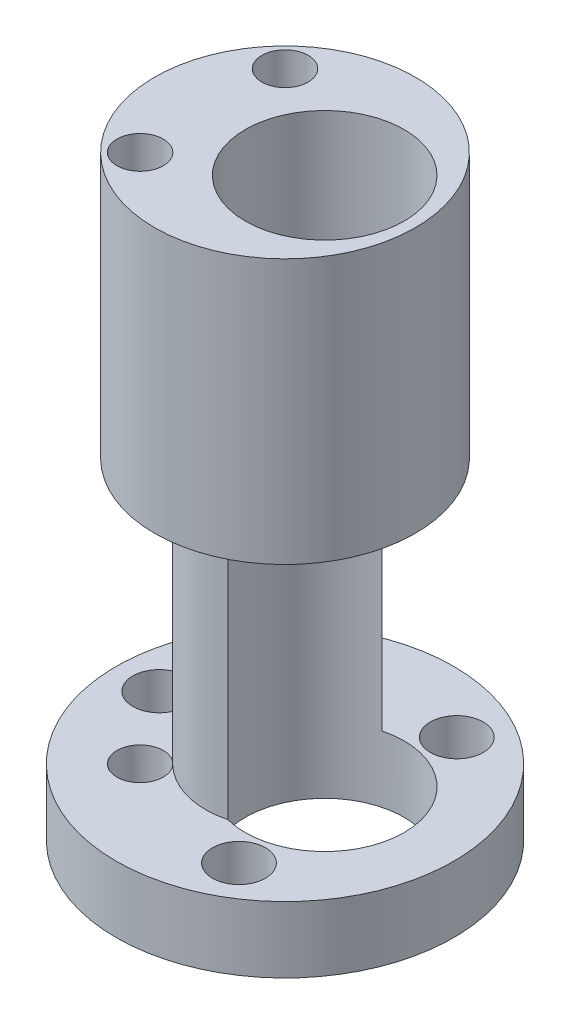
ISO-10303-21;
HEADER;
FILE_DESCRIPTION(('STEP AP214'),'2;1');
FILE_NAME('part.step','',(''),(''),'','','');
FILE_SCHEMA(('AUTOMOTIVE_DESIGN { 1 0 10303 214 1 1 1 1 }'));
ENDSEC;
DATA;
#1=APPLICATION_CONTEXT('core data for automotive mechanical design processes');
#2=APPLICATION_PROTOCOL_DEFINITION('international standard','automotive_design',2000,#1);
#3=PRODUCT_CONTEXT('',#1,'mechanical');
#4=PRODUCT('Part','Part','',(#3));
#5=PRODUCT_RELATED_PRODUCT_CATEGORY('part','',(#4));
#6=PRODUCT_DEFINITION_FORMATION('','',#4);
#7=PRODUCT_DEFINITION_CONTEXT('part definition',#1,'design');
#8=PRODUCT_DEFINITION('design','',#6,#7);
#9=PRODUCT_DEFINITION_SHAPE('','',#8);
#10=(LENGTH_UNIT() NAMED_UNIT(*) SI_UNIT(.MILLI.,.METRE.));
#11=(NAMED_UNIT(*) PLANE_ANGLE_UNIT() SI_UNIT($,.RADIAN.));
#12=(NAMED_UNIT(*) SI_UNIT($,.STERADIAN.) SOLID_ANGLE_UNIT());
#13=UNCERTAINTY_MEASURE_WITH_UNIT(LENGTH_MEASURE(1.E-05),#10,'distance_accuracy_value','');
#14=(GEOMETRIC_REPRESENTATION_CONTEXT(3) GLOBAL_UNCERTAINTY_ASSIGNED_CONTEXT((#13)) GLOBAL_UNIT_ASSIGNED_CONTEXT((#10,
#11,#12)) REPRESENTATION_CONTEXT('',''));
#15=CARTESIAN_POINT('',(0.,0.,0.));
#16=DIRECTION('',(0.,0.,1.));
#17=DIRECTION('',(1.,0.,0.));
#18=AXIS2_PLACEMENT_3D('',#15,#16,#17);
#19=CARTESIAN_POINT('',(0.,5.,0.));
#20=DIRECTION('',(0.,1.,0.));
#21=DIRECTION('',(0.,0.,1.));
#22=AXIS2_PLACEMENT_3D('',#19,#20,#21);
#23=PLANE('',#22);
#24=CARTESIAN_POINT('',(-5.47300648638387,5.,5.47300648638389));
#25=DIRECTION('',(0.,1.,0.));
#26=DIRECTION('',(0.,0.,1.));
#27=AXIS2_PLACEMENT_3D('',#24,#25,#26);
#28=CIRCLE('',#27,1.74999999999999);
#29=CARTESIAN_POINT('',(-4.35734177160285,5.,4.12475122709782));
#30=VERTEX_POINT('',#29);
#31=CARTESIAN_POINT('',(-4.1247512270978,5.,4.35734177160287));
#32=VERTEX_POINT('',#31);
#33=EDGE_CURVE('E93',#30,#32,#28,.T.);
#34=ORIENTED_EDGE('',*,*,#33,.F.);
#35=CARTESIAN_POINT('',(0.,5.,0.));
#36=DIRECTION('',(0.,1.,0.));
#37=DIRECTION('',(0.,0.,1.));
#38=AXIS2_PLACEMENT_3D('',#35,#36,#37);
#39=CIRCLE('',#38,6.);
#40=CARTESIAN_POINT('',(-4.35734177160288,5.,-4.12475122709779));
#41=VERTEX_POINT('',#40);
#42=EDGE_CURVE('E87',#41,#30,#39,.T.);
#43=ORIENTED_EDGE('',*,*,#42,.F.);
#44=CARTESIAN_POINT('',(-5.47300648638391,5.,-5.47300648638385));
#45=DIRECTION('',(0.,1.,0.));
#46=DIRECTION('',(0.,0.,1.));
#47=AXIS2_PLACEMENT_3D('',#44,#45,#46);
#48=CIRCLE('',#47,1.74999999999999);
#49=CARTESIAN_POINT('',(-4.12475122709783,5.,-4.35734177160283));
#50=VERTEX_POINT('',#49);
#51=EDGE_CURVE('E167',#50,#41,#48,.T.);
#52=ORIENTED_EDGE('',*,*,#51,.F.);
#53=CARTESIAN_POINT('',(1.50000000000002,5.,-5.80947501931112));
#54=VERTEX_POINT('',#53);
#55=EDGE_CURVE('E106',#54,#50,#39,.T.);
#56=ORIENTED_EDGE('',*,*,#55,.F.);
#57=CARTESIAN_POINT('',(3.,5.,0.));
#58=DIRECTION('',(0.,1.,0.));
#59=DIRECTION('',(0.,0.,1.));
#60=AXIS2_PLACEMENT_3D('',#57,#58,#59);
#61=CIRCLE('',#60,5.99999999999999);
#62=CARTESIAN_POINT('',(1.50000000000002,5.,5.80947501931112));
#63=VERTEX_POINT('',#62);
#64=EDGE_CURVE('E166',#63,#54,#61,.T.);
#65=ORIENTED_EDGE('',*,*,#64,.F.);
#66=EDGE_CURVE('E88',#32,#63,#39,.T.);
#67=ORIENTED_EDGE('',*,*,#66,.F.);
#68=EDGE_LOOP('',(#34,#43,#52,#56,#65,#67));
#69=FACE_BOUND('',#68,.T.);
#70=CARTESIAN_POINT('',(0.,5.,0.));
#71=DIRECTION('',(0.,1.,0.));
#72=DIRECTION('',(0.,0.,1.));
#73=AXIS2_PLACEMENT_3D('',#70,#71,#72);
#74=CIRCLE('',#73,12.75);
#75=CARTESIAN_POINT('',(0.,5.,12.75));
#76=VERTEX_POINT('',#75);
#77=EDGE_CURVE('E131',#76,#76,#74,.T.);
#78=ORIENTED_EDGE('',*,*,#77,.T.);
#79=EDGE_LOOP('',(#78));
#80=FACE_BOUND('',#79,.T.);
#81=CARTESIAN_POINT('',(4.75000000000004,5.,-8.22724133595215));
#82=DIRECTION('',(0.,1.,0.));
#83=DIRECTION('',(0.,0.,1.));
#84=AXIS2_PLACEMENT_3D('',#81,#82,#83);
#85=CIRCLE('',#84,1.99999999999999);
#86=CARTESIAN_POINT('',(4.75000000000004,5.,-6.22724133595215));
#87=VERTEX_POINT('',#86);
#88=EDGE_CURVE('E124',#87,#87,#85,.T.);
#89=ORIENTED_EDGE('',*,*,#88,.F.);
#90=EDGE_LOOP('',(#89));
#91=FACE_BOUND('',#90,.T.);
#92=CARTESIAN_POINT('',(4.75000000000004,5.,8.22724133595214));
#93=DIRECTION('',(0.,1.,0.));
#94=DIRECTION('',(0.,0.,1.));
#95=AXIS2_PLACEMENT_3D('',#92,#93,#94);
#96=CIRCLE('',#95,1.99999999999999);
#97=CARTESIAN_POINT('',(4.75000000000004,5.,10.2272413359521));
#98=VERTEX_POINT('',#97);
#99=EDGE_CURVE('E118',#98,#98,#96,.T.);
#100=ORIENTED_EDGE('',*,*,#99,.F.);
#101=EDGE_LOOP('',(#100));
#102=FACE_BOUND('',#101,.T.);
#103=CARTESIAN_POINT('',(-9.5,5.,0.));
#104=DIRECTION('',(0.,1.,0.));
#105=DIRECTION('',(0.,0.,1.));
#106=AXIS2_PLACEMENT_3D('',#103,#104,#105);
#107=CIRCLE('',#106,1.99999999999999);
#108=CARTESIAN_POINT('',(-9.5,5.,1.99999999999999));
#109=VERTEX_POINT('',#108);
#110=EDGE_CURVE('E112',#109,#109,#107,.T.);
#111=ORIENTED_EDGE('',*,*,#110,.F.);
#112=EDGE_LOOP('',(#111));
#113=FACE_BOUND('',#112,.T.);
#114=ADVANCED_FACE('F32',(#69,#80,#91,#102,#113),#23,.T.);
#115=CARTESIAN_POINT('',(0.,5.,0.));
#116=DIRECTION('',(0.,-1.,0.));
#117=DIRECTION('',(0.,0.,-1.));
#118=AXIS2_PLACEMENT_3D('',#115,#116,#117);
#119=CYLINDRICAL_SURFACE('',#118,12.75);
#120=ORIENTED_EDGE('',*,*,#77,.F.);
#121=EDGE_LOOP('',(#120));
#122=FACE_BOUND('',#121,.T.);
#123=CARTESIAN_POINT('',(0.,0.,0.));
#124=DIRECTION('',(0.,1.,0.));
#125=DIRECTION('',(0.,0.,1.));
#126=AXIS2_PLACEMENT_3D('',#123,#124,#125);
#127=CIRCLE('',#126,12.75);
#128=CARTESIAN_POINT('',(0.,0.,12.75));
#129=VERTEX_POINT('',#128);
#130=EDGE_CURVE('E130',#129,#129,#127,.T.);
#131=ORIENTED_EDGE('',*,*,#130,.T.);
#132=EDGE_LOOP('',(#131));
#133=FACE_BOUND('',#132,.T.);
#134=ADVANCED_FACE('F34',(#122,#133),#119,.T.);
#135=CARTESIAN_POINT('',(0.,0.,0.));
#136=DIRECTION('',(0.,1.,0.));
#137=DIRECTION('',(0.,0.,1.));
#138=AXIS2_PLACEMENT_3D('',#135,#136,#137);
#139=PLANE('',#138);
#140=CARTESIAN_POINT('',(-5.47300648638387,0.,5.47300648638389));
#141=DIRECTION('',(0.,1.,0.));
#142=DIRECTION('',(0.,0.,1.));
#143=AXIS2_PLACEMENT_3D('',#140,#141,#142);
#144=CIRCLE('',#143,1.74999999999999);
#145=CARTESIAN_POINT('',(-5.47300648638387,0.,7.22300648638388));
#146=VERTEX_POINT('',#145);
#147=EDGE_CURVE('E95',#146,#146,#144,.T.);
#148=ORIENTED_EDGE('',*,*,#147,.T.);
#149=EDGE_LOOP('',(#148));
#150=FACE_BOUND('',#149,.T.);
#151=CARTESIAN_POINT('',(-5.47300648638391,0.,-5.47300648638385));
#152=DIRECTION('',(0.,1.,0.));
#153=DIRECTION('',(0.,0.,1.));
#154=AXIS2_PLACEMENT_3D('',#151,#152,#153);
#155=CIRCLE('',#154,1.74999999999999);
#156=CARTESIAN_POINT('',(-5.47300648638391,0.,-3.72300648638385));
#157=VERTEX_POINT('',#156);
#158=EDGE_CURVE('E170',#157,#157,#155,.T.);
#159=ORIENTED_EDGE('',*,*,#158,.T.);
#160=EDGE_LOOP('',(#159));
#161=FACE_BOUND('',#160,.T.);
#162=CARTESIAN_POINT('',(3.,0.,0.));
#163=DIRECTION('',(0.,1.,0.));
#164=DIRECTION('',(0.,0.,1.));
#165=AXIS2_PLACEMENT_3D('',#162,#163,#164);
#166=CIRCLE('',#165,5.99999999999999);
#167=CARTESIAN_POINT('',(3.,0.,5.99999999999999));
#168=VERTEX_POINT('',#167);
#169=EDGE_CURVE('E164',#168,#168,#166,.T.);
#170=ORIENTED_EDGE('',*,*,#169,.T.);
#171=EDGE_LOOP('',(#170));
#172=FACE_BOUND('',#171,.T.);
#173=CARTESIAN_POINT('',(-9.5,0.,0.));
#174=DIRECTION('',(0.,1.,0.));
#175=DIRECTION('',(0.,0.,1.));
#176=AXIS2_PLACEMENT_3D('',#173,#174,#175);
#177=CIRCLE('',#176,2.);
#178=CARTESIAN_POINT('',(-9.5,0.,2.));
#179=VERTEX_POINT('',#178);
#180=EDGE_CURVE('E115',#179,#179,#177,.T.);
#181=ORIENTED_EDGE('',*,*,#180,.T.);
#182=EDGE_LOOP('',(#181));
#183=FACE_BOUND('',#182,.T.);
#184=CARTESIAN_POINT('',(4.75000000000004,0.,8.22724133595214));
#185=DIRECTION('',(0.,1.,0.));
#186=DIRECTION('',(0.,0.,1.));
#187=AXIS2_PLACEMENT_3D('',#184,#185,#186);
#188=CIRCLE('',#187,2.);
#189=CARTESIAN_POINT('',(4.75000000000004,0.,10.2272413359521));
#190=VERTEX_POINT('',#189);
#191=EDGE_CURVE('E121',#190,#190,#188,.T.);
#192=ORIENTED_EDGE('',*,*,#191,.T.);
#193=EDGE_LOOP('',(#192));
#194=FACE_BOUND('',#193,.T.);
#195=CARTESIAN_POINT('',(4.75000000000004,0.,-8.22724133595215));
#196=DIRECTION('',(0.,1.,0.));
#197=DIRECTION('',(0.,0.,1.));
#198=AXIS2_PLACEMENT_3D('',#195,#196,#197);
#199=CIRCLE('',#198,2.);
#200=CARTESIAN_POINT('',(4.75000000000004,0.,-6.22724133595215));
#201=VERTEX_POINT('',#200);
#202=EDGE_CURVE('E127',#201,#201,#199,.T.);
#203=ORIENTED_EDGE('',*,*,#202,.T.);
#204=EDGE_LOOP('',(#203));
#205=FACE_BOUND('',#204,.T.);
#206=ORIENTED_EDGE('',*,*,#130,.F.);
#207=EDGE_LOOP('',(#206));
#208=FACE_BOUND('',#207,.T.);
#209=ADVANCED_FACE('F219',(#150,#161,#172,#183,#194,#205,#208),#139,.F.);
#210=CARTESIAN_POINT('',(4.75000000000004,5.,-8.22724133595215));
#211=DIRECTION('',(0.,1.,0.));
#212=DIRECTION('',(0.,0.,1.));
#213=AXIS2_PLACEMENT_3D('',#210,#211,#212);
#214=CYLINDRICAL_SURFACE('',#213,2.);
#215=ORIENTED_EDGE('',*,*,#202,.F.);
#216=EDGE_LOOP('',(#215));
#217=FACE_BOUND('',#216,.T.);
#218=ORIENTED_EDGE('',*,*,#88,.T.);
#219=EDGE_LOOP('',(#218));
#220=FACE_BOUND('',#219,.T.);
#221=ADVANCED_FACE('F222',(#217,#220),#214,.F.);
#222=CARTESIAN_POINT('',(4.75000000000004,5.,8.22724133595214));
#223=DIRECTION('',(0.,1.,0.));
#224=DIRECTION('',(0.,0.,1.));
#225=AXIS2_PLACEMENT_3D('',#222,#223,#224);
#226=CYLINDRICAL_SURFACE('',#225,2.);
#227=ORIENTED_EDGE('',*,*,#191,.F.);
#228=EDGE_LOOP('',(#227));
#229=FACE_BOUND('',#228,.T.);
#230=ORIENTED_EDGE('',*,*,#99,.T.);
#231=EDGE_LOOP('',(#230));
#232=FACE_BOUND('',#231,.T.);
#233=ADVANCED_FACE('F229',(#229,#232),#226,.F.);
#234=CARTESIAN_POINT('',(-9.5,5.,0.));
#235=DIRECTION('',(0.,1.,0.));
#236=DIRECTION('',(0.,0.,1.));
#237=AXIS2_PLACEMENT_3D('',#234,#235,#236);
#238=CYLINDRICAL_SURFACE('',#237,2.);
#239=ORIENTED_EDGE('',*,*,#180,.F.);
#240=EDGE_LOOP('',(#239));
#241=FACE_BOUND('',#240,.T.);
#242=ORIENTED_EDGE('',*,*,#110,.T.);
#243=EDGE_LOOP('',(#242));
#244=FACE_BOUND('',#243,.T.);
#245=ADVANCED_FACE('F211',(#241,#244),#238,.F.);
#246=CARTESIAN_POINT('',(0.,25.,0.));
#247=DIRECTION('',(0.,-1.,0.));
#248=DIRECTION('',(0.,0.,-1.));
#249=AXIS2_PLACEMENT_3D('',#246,#247,#248);
#250=CYLINDRICAL_SURFACE('',#249,6.);
#251=ORIENTED_EDGE('',*,*,#55,.T.);
#252=EDGE_CURVE('E105',#50,#41,#39,.T.);
#253=ORIENTED_EDGE('',*,*,#252,.T.);
#254=ORIENTED_EDGE('',*,*,#42,.T.);
#255=EDGE_CURVE('E83',#30,#32,#39,.T.);
#256=ORIENTED_EDGE('',*,*,#255,.T.);
#257=ORIENTED_EDGE('',*,*,#66,.T.);
#258=DIRECTION('',(0.,1.,0.));
#259=VECTOR('',#258,1.);
#260=CARTESIAN_POINT('',(1.50000000000002,22.5,5.80947501931112));
#261=LINE('',#260,#259);
#262=CARTESIAN_POINT('',(1.50000000000002,25.,5.80947501931112));
#263=VERTEX_POINT('',#262);
#264=EDGE_CURVE('E152',#63,#263,#261,.T.);
#265=ORIENTED_EDGE('',*,*,#264,.T.);
#266=CARTESIAN_POINT('',(0.,25.,0.));
#267=DIRECTION('',(0.,1.,0.));
#268=DIRECTION('',(0.,0.,1.));
#269=AXIS2_PLACEMENT_3D('',#266,#267,#268);
#270=CIRCLE('',#269,6.);
#271=CARTESIAN_POINT('',(-4.12475122709779,25.,4.35734177160287));
#272=VERTEX_POINT('',#271);
#273=EDGE_CURVE('E109',#272,#263,#270,.T.);
#274=ORIENTED_EDGE('',*,*,#273,.F.);
#275=CARTESIAN_POINT('',(-4.35734177160286,25.,4.12475122709781));
#276=VERTEX_POINT('',#275);
#277=EDGE_CURVE('E150',#276,#272,#270,.T.);
#278=ORIENTED_EDGE('',*,*,#277,.F.);
#279=CARTESIAN_POINT('',(-4.35734177160289,25.,-4.12475122709778));
#280=VERTEX_POINT('',#279);
#281=EDGE_CURVE('E144',#280,#276,#270,.T.);
#282=ORIENTED_EDGE('',*,*,#281,.F.);
#283=CARTESIAN_POINT('',(-4.12475122709782,25.,-4.35734177160284));
#284=VERTEX_POINT('',#283);
#285=EDGE_CURVE('E153',#284,#280,#270,.T.);
#286=ORIENTED_EDGE('',*,*,#285,.F.);
#287=CARTESIAN_POINT('',(1.50000000000002,25.,-5.80947501931112));
#288=VERTEX_POINT('',#287);
#289=EDGE_CURVE('E110',#288,#284,#270,.T.);
#290=ORIENTED_EDGE('',*,*,#289,.F.);
#291=DIRECTION('',(0.,1.,0.));
#292=VECTOR('',#291,1.);
#293=CARTESIAN_POINT('',(1.50000000000002,22.5,-5.80947501931112));
#294=LINE('',#293,#292);
#295=EDGE_CURVE('E161',#288,#54,#294,.F.);
#296=ORIENTED_EDGE('',*,*,#295,.T.);
#297=EDGE_LOOP('',(#251,#253,#254,#256,#257,#265,#274,#278,#282,#286,#290,#296));
#298=FACE_BOUND('',#297,.T.);
#299=ADVANCED_FACE('F104',(#298),#250,.T.);
#300=CARTESIAN_POINT('',(0.,25.,0.));
#301=DIRECTION('',(0.,1.,0.));
#302=DIRECTION('',(0.,0.,1.));
#303=AXIS2_PLACEMENT_3D('',#300,#301,#302);
#304=PLANE('',#303);
#305=CARTESIAN_POINT('',(0.,25.,0.));
#306=DIRECTION('',(0.,1.,0.));
#307=DIRECTION('',(0.,0.,1.));
#308=AXIS2_PLACEMENT_3D('',#305,#306,#307);
#309=CIRCLE('',#308,9.85);
#310=CARTESIAN_POINT('',(0.,25.,9.85));
#311=VERTEX_POINT('',#310);
#312=EDGE_CURVE('E194',#311,#311,#309,.T.);
#313=ORIENTED_EDGE('',*,*,#312,.F.);
#314=EDGE_LOOP('',(#313));
#315=FACE_BOUND('',#314,.T.);
#316=ORIENTED_EDGE('',*,*,#289,.T.);
#317=CARTESIAN_POINT('',(-5.47300648638391,25.,-5.47300648638385));
#318=DIRECTION('',(0.,1.,0.));
#319=DIRECTION('',(0.,0.,1.));
#320=AXIS2_PLACEMENT_3D('',#317,#318,#319);
#321=CIRCLE('',#320,1.74999999999999);
#322=EDGE_CURVE('E11',#284,#280,#321,.T.);
#323=ORIENTED_EDGE('',*,*,#322,.T.);
#324=ORIENTED_EDGE('',*,*,#281,.T.);
#325=CARTESIAN_POINT('',(-5.47300648638387,25.,5.47300648638389));
#326=DIRECTION('',(0.,1.,0.));
#327=DIRECTION('',(0.,0.,1.));
#328=AXIS2_PLACEMENT_3D('',#325,#326,#327);
#329=CIRCLE('',#328,1.74999999999999);
#330=EDGE_CURVE('E40',#276,#272,#329,.T.);
#331=ORIENTED_EDGE('',*,*,#330,.T.);
#332=ORIENTED_EDGE('',*,*,#273,.T.);
#333=CARTESIAN_POINT('',(3.,25.,0.));
#334=DIRECTION('',(0.,1.,0.));
#335=DIRECTION('',(0.,0.,1.));
#336=AXIS2_PLACEMENT_3D('',#333,#334,#335);
#337=CIRCLE('',#336,5.99999999999999);
#338=EDGE_CURVE('E159',#263,#288,#337,.T.);
#339=ORIENTED_EDGE('',*,*,#338,.T.);
#340=EDGE_LOOP('',(#316,#323,#324,#331,#332,#339));
#341=FACE_BOUND('',#340,.T.);
#342=ADVANCED_FACE('F140',(#315,#341),#304,.F.);
#343=CARTESIAN_POINT('',(0.,45.,0.));
#344=DIRECTION('',(0.,-1.,0.));
#345=DIRECTION('',(0.,0.,-1.));
#346=AXIS2_PLACEMENT_3D('',#343,#344,#345);
#347=CYLINDRICAL_SURFACE('',#346,9.85);
#348=CARTESIAN_POINT('',(0.,45.,0.));
#349=DIRECTION('',(0.,1.,0.));
#350=DIRECTION('',(0.,0.,1.));
#351=AXIS2_PLACEMENT_3D('',#348,#349,#350);
#352=CIRCLE('',#351,9.85);
#353=CARTESIAN_POINT('',(0.,45.,9.85));
#354=VERTEX_POINT('',#353);
#355=EDGE_CURVE('E195',#354,#354,#352,.T.);
#356=ORIENTED_EDGE('',*,*,#355,.F.);
#357=EDGE_LOOP('',(#356));
#358=FACE_BOUND('',#357,.T.);
#359=ORIENTED_EDGE('',*,*,#312,.T.);
#360=EDGE_LOOP('',(#359));
#361=FACE_BOUND('',#360,.T.);
#362=ADVANCED_FACE('F200',(#358,#361),#347,.T.);
#363=CARTESIAN_POINT('',(0.,45.,0.));
#364=DIRECTION('',(0.,1.,0.));
#365=DIRECTION('',(0.,0.,1.));
#366=AXIS2_PLACEMENT_3D('',#363,#364,#365);
#367=PLANE('',#366);
#368=CARTESIAN_POINT('',(-5.47300648638391,45.,-5.47300648638385));
#369=DIRECTION('',(0.,1.,0.));
#370=DIRECTION('',(0.,0.,1.));
#371=AXIS2_PLACEMENT_3D('',#368,#369,#370);
#372=CIRCLE('',#371,1.74999999999999);
#373=CARTESIAN_POINT('',(-5.47300648638391,45.,-3.72300648638386));
#374=VERTEX_POINT('',#373);
#375=EDGE_CURVE('E176',#374,#374,#372,.T.);
#376=ORIENTED_EDGE('',*,*,#375,.F.);
#377=EDGE_LOOP('',(#376));
#378=FACE_BOUND('',#377,.T.);
#379=CARTESIAN_POINT('',(-5.47300648638387,45.,5.47300648638389));
#380=DIRECTION('',(0.,1.,0.));
#381=DIRECTION('',(0.,0.,1.));
#382=AXIS2_PLACEMENT_3D('',#379,#380,#381);
#383=CIRCLE('',#382,1.74999999999999);
#384=CARTESIAN_POINT('',(-5.47300648638387,45.,7.22300648638388));
#385=VERTEX_POINT('',#384);
#386=EDGE_CURVE('E181',#385,#385,#383,.T.);
#387=ORIENTED_EDGE('',*,*,#386,.F.);
#388=EDGE_LOOP('',(#387));
#389=FACE_BOUND('',#388,.T.);
#390=CARTESIAN_POINT('',(3.,45.,0.));
#391=DIRECTION('',(0.,1.,0.));
#392=DIRECTION('',(0.,0.,1.));
#393=AXIS2_PLACEMENT_3D('',#390,#391,#392);
#394=CIRCLE('',#393,5.99999999999999);
#395=CARTESIAN_POINT('',(3.,45.,5.99999999999999));
#396=VERTEX_POINT('',#395);
#397=EDGE_CURVE('E186',#396,#396,#394,.T.);
#398=ORIENTED_EDGE('',*,*,#397,.F.);
#399=EDGE_LOOP('',(#398));
#400=FACE_BOUND('',#399,.T.);
#401=ORIENTED_EDGE('',*,*,#355,.T.);
#402=EDGE_LOOP('',(#401));
#403=FACE_BOUND('',#402,.T.);
#404=ADVANCED_FACE('F208',(#378,#389,#400,#403),#367,.T.);
#405=CARTESIAN_POINT('',(3.,45.,0.));
#406=DIRECTION('',(0.,1.,0.));
#407=DIRECTION('',(0.,0.,1.));
#408=AXIS2_PLACEMENT_3D('',#405,#406,#407);
#409=CYLINDRICAL_SURFACE('',#408,5.99999999999999);
#410=ORIENTED_EDGE('',*,*,#397,.T.);
#411=EDGE_LOOP('',(#410));
#412=FACE_BOUND('',#411,.T.);
#413=ORIENTED_EDGE('',*,*,#169,.F.);
#414=EDGE_LOOP('',(#413));
#415=FACE_BOUND('',#414,.T.);
#416=ORIENTED_EDGE('',*,*,#64,.T.);
#417=ORIENTED_EDGE('',*,*,#295,.F.);
#418=ORIENTED_EDGE('',*,*,#338,.F.);
#419=ORIENTED_EDGE('',*,*,#264,.F.);
#420=EDGE_LOOP('',(#416,#417,#418,#419));
#421=FACE_BOUND('',#420,.T.);
#422=ADVANCED_FACE('F340',(#412,#415,#421),#409,.F.);
#423=CARTESIAN_POINT('',(0.,25.,0.));
#424=DIRECTION('',(0.,1.,0.));
#425=DIRECTION('',(0.,0.,1.));
#426=AXIS2_PLACEMENT_3D('',#423,#424,#425);
#427=PLANE('',#426);
#428=ORIENTED_EDGE('',*,*,#277,.T.);
#429=CARTESIAN_POINT('',(-5.47300648638387,25.,5.47300648638389));
#430=DIRECTION('',(0.,1.,0.));
#431=DIRECTION('',(0.,0.,1.));
#432=AXIS2_PLACEMENT_3D('',#429,#430,#431);
#433=CIRCLE('',#432,1.74999999999999);
#434=EDGE_CURVE('E184',#276,#272,#433,.F.);
#435=ORIENTED_EDGE('',*,*,#434,.F.);
#436=EDGE_LOOP('',(#428,#435));
#437=FACE_BOUND('',#436,.T.);
#438=ADVANCED_FACE('F337',(#437),#427,.T.);
#439=CARTESIAN_POINT('',(-5.47300648638387,45.,5.47300648638389));
#440=DIRECTION('',(0.,1.,0.));
#441=DIRECTION('',(0.,0.,1.));
#442=AXIS2_PLACEMENT_3D('',#439,#440,#441);
#443=CYLINDRICAL_SURFACE('',#442,1.74999999999999);
#444=ORIENTED_EDGE('',*,*,#434,.T.);
#445=ORIENTED_EDGE('',*,*,#330,.F.);
#446=EDGE_LOOP('',(#444,#445));
#447=FACE_BOUND('',#446,.T.);
#448=ORIENTED_EDGE('',*,*,#386,.T.);
#449=EDGE_LOOP('',(#448));
#450=FACE_BOUND('',#449,.T.);
#451=ADVANCED_FACE('F334',(#447,#450),#443,.F.);
#452=CARTESIAN_POINT('',(0.,25.,0.));
#453=DIRECTION('',(0.,1.,0.));
#454=DIRECTION('',(0.,0.,1.));
#455=AXIS2_PLACEMENT_3D('',#452,#453,#454);
#456=PLANE('',#455);
#457=ORIENTED_EDGE('',*,*,#285,.T.);
#458=CARTESIAN_POINT('',(-5.47300648638391,25.,-5.47300648638385));
#459=DIRECTION('',(0.,1.,0.));
#460=DIRECTION('',(0.,0.,1.));
#461=AXIS2_PLACEMENT_3D('',#458,#459,#460);
#462=CIRCLE('',#461,1.74999999999999);
#463=EDGE_CURVE('E179',#284,#280,#462,.F.);
#464=ORIENTED_EDGE('',*,*,#463,.F.);
#465=EDGE_LOOP('',(#457,#464));
#466=FACE_BOUND('',#465,.T.);
#467=ADVANCED_FACE('F331',(#466),#456,.T.);
#468=CARTESIAN_POINT('',(-5.47300648638391,45.,-5.47300648638385));
#469=DIRECTION('',(0.,1.,0.));
#470=DIRECTION('',(0.,0.,1.));
#471=AXIS2_PLACEMENT_3D('',#468,#469,#470);
#472=CYLINDRICAL_SURFACE('',#471,1.74999999999999);
#473=ORIENTED_EDGE('',*,*,#463,.T.);
#474=ORIENTED_EDGE('',*,*,#322,.F.);
#475=EDGE_LOOP('',(#473,#474));
#476=FACE_BOUND('',#475,.T.);
#477=ORIENTED_EDGE('',*,*,#375,.T.);
#478=EDGE_LOOP('',(#477));
#479=FACE_BOUND('',#478,.T.);
#480=ADVANCED_FACE('F298',(#476,#479),#472,.F.);
#481=CARTESIAN_POINT('',(-3.72300648638392,5.,-5.47300648638385));
#482=DIRECTION('',(0.,1.,0.));
#483=DIRECTION('',(0.,0.,1.));
#484=AXIS2_PLACEMENT_3D('',#481,#482,#483);
#485=PLANE('',#484);
#486=EDGE_CURVE('E53',#41,#50,#48,.T.);
#487=ORIENTED_EDGE('',*,*,#486,.F.);
#488=ORIENTED_EDGE('',*,*,#252,.F.);
#489=EDGE_LOOP('',(#487,#488));
#490=FACE_BOUND('',#489,.T.);
#491=ADVANCED_FACE('F292',(#490),#485,.F.);
#492=CARTESIAN_POINT('',(-5.47300648638391,5.,-5.47300648638385));
#493=DIRECTION('',(0.,1.,0.));
#494=DIRECTION('',(0.,0.,1.));
#495=AXIS2_PLACEMENT_3D('',#492,#493,#494);
#496=CYLINDRICAL_SURFACE('',#495,1.74999999999999);
#497=ORIENTED_EDGE('',*,*,#158,.F.);
#498=EDGE_LOOP('',(#497));
#499=FACE_BOUND('',#498,.T.);
#500=ORIENTED_EDGE('',*,*,#486,.T.);
#501=ORIENTED_EDGE('',*,*,#51,.T.);
#502=EDGE_LOOP('',(#500,#501));
#503=FACE_BOUND('',#502,.T.);
#504=ADVANCED_FACE('F297',(#499,#503),#496,.F.);
#505=CARTESIAN_POINT('',(-3.72300648638388,5.,5.47300648638389));
#506=DIRECTION('',(0.,1.,0.));
#507=DIRECTION('',(0.,0.,1.));
#508=AXIS2_PLACEMENT_3D('',#505,#506,#507);
#509=PLANE('',#508);
#510=EDGE_CURVE('E46',#32,#30,#28,.T.);
#511=ORIENTED_EDGE('',*,*,#510,.F.);
#512=ORIENTED_EDGE('',*,*,#255,.F.);
#513=EDGE_LOOP('',(#511,#512));
#514=FACE_BOUND('',#513,.T.);
#515=ADVANCED_FACE('F84',(#514),#509,.F.);
#516=CARTESIAN_POINT('',(-5.47300648638387,5.,5.47300648638389));
#517=DIRECTION('',(0.,1.,0.));
#518=DIRECTION('',(0.,0.,1.));
#519=AXIS2_PLACEMENT_3D('',#516,#517,#518);
#520=CYLINDRICAL_SURFACE('',#519,1.74999999999999);
#521=ORIENTED_EDGE('',*,*,#147,.F.);
#522=EDGE_LOOP('',(#521));
#523=FACE_BOUND('',#522,.T.);
#524=ORIENTED_EDGE('',*,*,#510,.T.);
#525=ORIENTED_EDGE('',*,*,#33,.T.);
#526=EDGE_LOOP('',(#524,#525));
#527=FACE_BOUND('',#526,.T.);
#528=ADVANCED_FACE('F92',(#523,#527),#520,.F.);
#529=CLOSED_SHELL('',(#114,#134,#209,#221,#233,#245,#299,#342,#362,#404,#422,#438,#451,#467,
#480,#491,#504,#515,#528));
#530=MANIFOLD_SOLID_BREP('B2',#529);
#531=ADVANCED_BREP_SHAPE_REPRESENTATION('',(#18,#530),#14);
#532=SHAPE_DEFINITION_REPRESENTATION(#9,#531);
ENDSEC;
END-ISO-10303-21;
